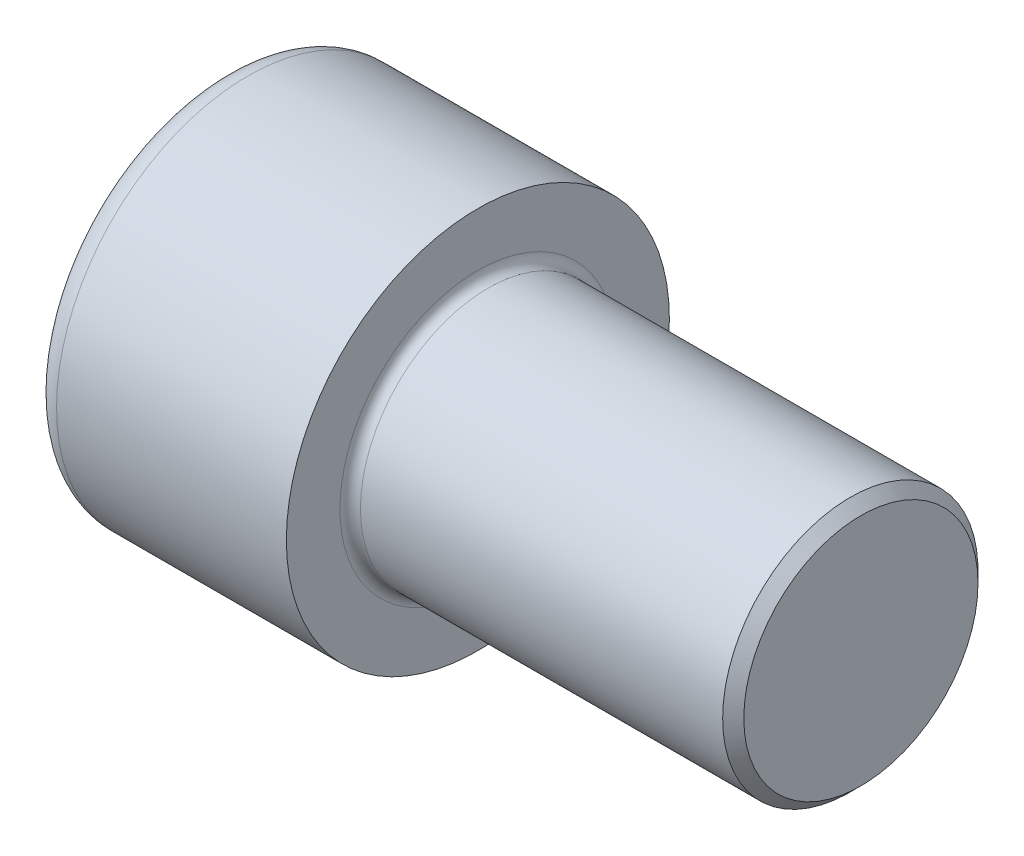
ISO-10303-21;
HEADER;
FILE_DESCRIPTION(('STEP AP214'),'2;1');
FILE_NAME('part.step','',(''),(''),'','','');
FILE_SCHEMA(('AUTOMOTIVE_DESIGN { 1 0 10303 214 1 1 1 1 }'));
ENDSEC;
DATA;
#1=APPLICATION_CONTEXT('core data for automotive mechanical design processes');
#2=APPLICATION_PROTOCOL_DEFINITION('international standard','automotive_design',2000,#1);
#3=PRODUCT_CONTEXT('',#1,'mechanical');
#4=PRODUCT('Part','Part','',(#3));
#5=PRODUCT_RELATED_PRODUCT_CATEGORY('part','',(#4));
#6=PRODUCT_DEFINITION_FORMATION('','',#4);
#7=PRODUCT_DEFINITION_CONTEXT('part definition',#1,'design');
#8=PRODUCT_DEFINITION('design','',#6,#7);
#9=PRODUCT_DEFINITION_SHAPE('','',#8);
#10=(LENGTH_UNIT() NAMED_UNIT(*) SI_UNIT(.MILLI.,.METRE.));
#11=(NAMED_UNIT(*) PLANE_ANGLE_UNIT() SI_UNIT($,.RADIAN.));
#12=(NAMED_UNIT(*) SI_UNIT($,.STERADIAN.) SOLID_ANGLE_UNIT());
#13=UNCERTAINTY_MEASURE_WITH_UNIT(LENGTH_MEASURE(1.E-05),#10,'distance_accuracy_value','');
#14=(GEOMETRIC_REPRESENTATION_CONTEXT(3) GLOBAL_UNCERTAINTY_ASSIGNED_CONTEXT((#13)) GLOBAL_UNIT_ASSIGNED_CONTEXT((#10,
#11,#12)) REPRESENTATION_CONTEXT('',''));
#15=CARTESIAN_POINT('',(0.,0.,0.));
#16=DIRECTION('',(0.,0.,1.));
#17=DIRECTION('',(1.,0.,0.));
#18=AXIS2_PLACEMENT_3D('',#15,#16,#17);
#19=CARTESIAN_POINT('',(0.,0.,0.));
#20=DIRECTION('',(-1.,0.,0.));
#21=DIRECTION('',(0.,0.,1.));
#22=AXIS2_PLACEMENT_3D('',#19,#20,#21);
#23=PLANE('',#22);
#24=DIRECTION('',(0.,-0.499999999999999,0.866025403784439));
#25=VECTOR('',#24,1.);
#26=CARTESIAN_POINT('',(0.,9.84382208968312,0.));
#27=LINE('',#26,#25);
#28=CARTESIAN_POINT('',(0.,9.84382208968312,0.));
#29=VERTEX_POINT('',#28);
#30=CARTESIAN_POINT('',(0.,4.92191104484157,8.52499999999999));
#31=VERTEX_POINT('',#30);
#32=EDGE_CURVE('E264',#29,#31,#27,.T.);
#33=ORIENTED_EDGE('',*,*,#32,.T.);
#34=DIRECTION('',(0.,1.,0.));
#35=VECTOR('',#34,1.);
#36=CARTESIAN_POINT('',(0.,-4.92191104484155,8.525));
#37=LINE('',#36,#35);
#38=CARTESIAN_POINT('',(0.,-4.92191104484155,8.525));
#39=VERTEX_POINT('',#38);
#40=EDGE_CURVE('E136',#39,#31,#37,.T.);
#41=ORIENTED_EDGE('',*,*,#40,.F.);
#42=DIRECTION('',(0.,-0.500000000000001,-0.866025403784438));
#43=VECTOR('',#42,1.);
#44=CARTESIAN_POINT('',(0.,-4.92191104484155,8.525));
#45=LINE('',#44,#43);
#46=CARTESIAN_POINT('',(0.,-9.84382208968312,0.));
#47=VERTEX_POINT('',#46);
#48=EDGE_CURVE('E267',#39,#47,#45,.T.);
#49=ORIENTED_EDGE('',*,*,#48,.T.);
#50=DIRECTION('',(0.,0.499999999999999,-0.866025403784439));
#51=VECTOR('',#50,1.);
#52=CARTESIAN_POINT('',(0.,-9.84382208968312,0.));
#53=LINE('',#52,#51);
#54=CARTESIAN_POINT('',(0.,-4.92191104484157,-8.525));
#55=VERTEX_POINT('',#54);
#56=EDGE_CURVE('E270',#47,#55,#53,.T.);
#57=ORIENTED_EDGE('',*,*,#56,.T.);
#58=DIRECTION('',(0.,-1.,0.));
#59=VECTOR('',#58,1.);
#60=CARTESIAN_POINT('',(0.,4.92191104484154,-8.52500000000001));
#61=LINE('',#60,#59);
#62=CARTESIAN_POINT('',(0.,4.92191104484154,-8.52500000000001));
#63=VERTEX_POINT('',#62);
#64=EDGE_CURVE('E273',#63,#55,#61,.T.);
#65=ORIENTED_EDGE('',*,*,#64,.F.);
#66=DIRECTION('',(0.,-0.500000000000001,-0.866025403784438));
#67=VECTOR('',#66,1.);
#68=CARTESIAN_POINT('',(0.,9.84382208968312,0.));
#69=LINE('',#68,#67);
#70=EDGE_CURVE('E131',#29,#63,#69,.T.);
#71=ORIENTED_EDGE('',*,*,#70,.F.);
#72=EDGE_LOOP('',(#33,#41,#49,#57,#65,#71));
#73=FACE_BOUND('',#72,.T.);
#74=CARTESIAN_POINT('',(0.,0.,0.));
#75=DIRECTION('',(-1.,0.,0.));
#76=DIRECTION('',(0.,0.,1.));
#77=AXIS2_PLACEMENT_3D('',#74,#75,#76);
#78=CIRCLE('',#77,13.);
#79=CARTESIAN_POINT('',(0.,0.,13.));
#80=VERTEX_POINT('',#79);
#81=EDGE_CURVE('E48',#80,#80,#78,.T.);
#82=ORIENTED_EDGE('',*,*,#81,.T.);
#83=EDGE_LOOP('',(#82));
#84=FACE_BOUND('',#83,.T.);
#85=ADVANCED_FACE('F40',(#73,#84),#23,.T.);
#86=CARTESIAN_POINT('',(-31.75,0.,0.));
#87=DIRECTION('',(-1.,0.,0.));
#88=DIRECTION('',(0.,0.,1.));
#89=AXIS2_PLACEMENT_3D('',#86,#87,#88);
#90=CYLINDRICAL_SURFACE('',#89,15.);
#91=CARTESIAN_POINT('',(2.,0.,0.));
#92=DIRECTION('',(-1.,0.,0.));
#93=DIRECTION('',(0.,0.,1.));
#94=AXIS2_PLACEMENT_3D('',#91,#92,#93);
#95=CIRCLE('',#94,15.);
#96=CARTESIAN_POINT('',(2.,0.,15.));
#97=VERTEX_POINT('',#96);
#98=EDGE_CURVE('E11',#97,#97,#95,.F.);
#99=ORIENTED_EDGE('',*,*,#98,.T.);
#100=EDGE_LOOP('',(#99));
#101=FACE_BOUND('',#100,.T.);
#102=CARTESIAN_POINT('',(20.,0.,0.));
#103=DIRECTION('',(-1.,0.,0.));
#104=DIRECTION('',(0.,0.,1.));
#105=AXIS2_PLACEMENT_3D('',#102,#103,#104);
#106=CIRCLE('',#105,15.);
#107=CARTESIAN_POINT('',(20.,0.,15.));
#108=VERTEX_POINT('',#107);
#109=EDGE_CURVE('E154',#108,#108,#106,.T.);
#110=ORIENTED_EDGE('',*,*,#109,.T.);
#111=EDGE_LOOP('',(#110));
#112=FACE_BOUND('',#111,.T.);
#113=ADVANCED_FACE('F179',(#101,#112),#90,.T.);
#114=CARTESIAN_POINT('',(20.,15.,0.));
#115=DIRECTION('',(1.,0.,0.));
#116=DIRECTION('',(0.,0.,-1.));
#117=AXIS2_PLACEMENT_3D('',#114,#115,#116);
#118=PLANE('',#117);
#119=CARTESIAN_POINT('',(20.,0.,0.));
#120=DIRECTION('',(1.,0.,0.));
#121=DIRECTION('',(0.,0.,-1.));
#122=AXIS2_PLACEMENT_3D('',#119,#120,#121);
#123=CIRCLE('',#122,10.8);
#124=CARTESIAN_POINT('',(20.,0.,-10.8));
#125=VERTEX_POINT('',#124);
#126=EDGE_CURVE('E157',#125,#125,#123,.F.);
#127=ORIENTED_EDGE('',*,*,#126,.T.);
#128=EDGE_LOOP('',(#127));
#129=FACE_BOUND('',#128,.T.);
#130=ORIENTED_EDGE('',*,*,#109,.F.);
#131=EDGE_LOOP('',(#130));
#132=FACE_BOUND('',#131,.T.);
#133=ADVANCED_FACE('F184',(#129,#132),#118,.T.);
#134=CARTESIAN_POINT('',(-31.75,0.,0.));
#135=DIRECTION('',(-1.,0.,0.));
#136=DIRECTION('',(0.,0.,1.));
#137=AXIS2_PLACEMENT_3D('',#134,#135,#136);
#138=CYLINDRICAL_SURFACE('',#137,10.);
#139=CARTESIAN_POINT('',(20.8,0.,0.));
#140=DIRECTION('',(1.,0.,0.));
#141=DIRECTION('',(0.,0.,-1.));
#142=AXIS2_PLACEMENT_3D('',#139,#140,#141);
#143=CIRCLE('',#142,10.);
#144=CARTESIAN_POINT('',(20.8,0.,-10.));
#145=VERTEX_POINT('',#144);
#146=EDGE_CURVE('E160',#145,#145,#143,.T.);
#147=ORIENTED_EDGE('',*,*,#146,.T.);
#148=EDGE_LOOP('',(#147));
#149=FACE_BOUND('',#148,.T.);
#150=CARTESIAN_POINT('',(49.172,0.,0.));
#151=DIRECTION('',(-1.,0.,0.));
#152=DIRECTION('',(0.,0.,1.));
#153=AXIS2_PLACEMENT_3D('',#150,#151,#152);
#154=CIRCLE('',#153,10.);
#155=CARTESIAN_POINT('',(49.172,0.,10.));
#156=VERTEX_POINT('',#155);
#157=EDGE_CURVE('E151',#156,#156,#154,.T.);
#158=ORIENTED_EDGE('',*,*,#157,.T.);
#159=EDGE_LOOP('',(#158));
#160=FACE_BOUND('',#159,.T.);
#161=ADVANCED_FACE('F190',(#149,#160),#138,.T.);
#162=CARTESIAN_POINT('',(50.,0.,0.));
#163=DIRECTION('',(-1.,0.,0.));
#164=DIRECTION('',(0.,0.,1.));
#165=AXIS2_PLACEMENT_3D('',#162,#163,#164);
#166=CONICAL_SURFACE('',#165,9.172,0.78539816339745);
#167=ORIENTED_EDGE('',*,*,#157,.F.);
#168=EDGE_LOOP('',(#167));
#169=FACE_BOUND('',#168,.T.);
#170=CARTESIAN_POINT('',(50.,0.,0.));
#171=DIRECTION('',(-1.,0.,0.));
#172=DIRECTION('',(0.,0.,1.));
#173=AXIS2_PLACEMENT_3D('',#170,#171,#172);
#174=CIRCLE('',#173,9.172);
#175=CARTESIAN_POINT('',(50.,0.,9.172));
#176=VERTEX_POINT('',#175);
#177=EDGE_CURVE('E147',#176,#176,#174,.T.);
#178=ORIENTED_EDGE('',*,*,#177,.T.);
#179=EDGE_LOOP('',(#178));
#180=FACE_BOUND('',#179,.T.);
#181=ADVANCED_FACE('F194',(#169,#180),#166,.T.);
#182=CARTESIAN_POINT('',(50.,9.172,0.));
#183=DIRECTION('',(1.,0.,0.));
#184=DIRECTION('',(0.,0.,-1.));
#185=AXIS2_PLACEMENT_3D('',#182,#183,#184);
#186=PLANE('',#185);
#187=ORIENTED_EDGE('',*,*,#177,.F.);
#188=EDGE_LOOP('',(#187));
#189=FACE_BOUND('',#188,.T.);
#190=ADVANCED_FACE('F176',(#189),#186,.T.);
#191=CARTESIAN_POINT('',(20.8,0.,0.));
#192=DIRECTION('',(1.,0.,0.));
#193=DIRECTION('',(0.,0.,-1.));
#194=AXIS2_PLACEMENT_3D('',#191,#192,#193);
#195=TOROIDAL_SURFACE('',#194,10.8,0.8);
#196=ORIENTED_EDGE('',*,*,#146,.F.);
#197=EDGE_LOOP('',(#196));
#198=FACE_BOUND('',#197,.T.);
#199=ORIENTED_EDGE('',*,*,#126,.F.);
#200=EDGE_LOOP('',(#199));
#201=FACE_BOUND('',#200,.T.);
#202=ADVANCED_FACE('F167',(#198,#201),#195,.F.);
#203=CARTESIAN_POINT('',(2.,0.,0.));
#204=DIRECTION('',(-1.,0.,0.));
#205=DIRECTION('',(0.,0.,1.));
#206=AXIS2_PLACEMENT_3D('',#203,#204,#205);
#207=TOROIDAL_SURFACE('',#206,13.,2.);
#208=ORIENTED_EDGE('',*,*,#98,.F.);
#209=EDGE_LOOP('',(#208));
#210=FACE_BOUND('',#209,.T.);
#211=ORIENTED_EDGE('',*,*,#81,.F.);
#212=EDGE_LOOP('',(#211));
#213=FACE_BOUND('',#212,.T.);
#214=ADVANCED_FACE('F42',(#210,#213),#207,.T.);
#215=CARTESIAN_POINT('',(10.,9.84382208968312,0.));
#216=DIRECTION('',(0.,-0.866025403784439,-0.499999999999999));
#217=DIRECTION('',(0.,0.499999999999999,-0.866025403784439));
#218=AXIS2_PLACEMENT_3D('',#215,#216,#217);
#219=PLANE('',#218);
#220=ORIENTED_EDGE('',*,*,#32,.F.);
#221=DIRECTION('',(-1.,0.,0.));
#222=VECTOR('',#221,1.);
#223=CARTESIAN_POINT('',(10.,9.84382208968312,0.));
#224=LINE('',#223,#222);
#225=CARTESIAN_POINT('',(10.,9.84382208968312,0.));
#226=VERTEX_POINT('',#225);
#227=EDGE_CURVE('E254',#226,#29,#224,.T.);
#228=ORIENTED_EDGE('',*,*,#227,.F.);
#229=DIRECTION('',(0.,-0.499999999999999,0.866025403784439));
#230=VECTOR('',#229,1.);
#231=CARTESIAN_POINT('',(10.,9.84382208968312,0.));
#232=LINE('',#231,#230);
#233=CARTESIAN_POINT('',(10.,7.38286656726234,4.26249999999999));
#234=VERTEX_POINT('',#233);
#235=EDGE_CURVE('E123',#226,#234,#232,.T.);
#236=ORIENTED_EDGE('',*,*,#235,.T.);
#237=CARTESIAN_POINT('',(10.,4.92191104484157,8.52499999999999));
#238=VERTEX_POINT('',#237);
#239=EDGE_CURVE('E114',#234,#238,#232,.T.);
#240=ORIENTED_EDGE('',*,*,#239,.T.);
#241=DIRECTION('',(-1.,0.,0.));
#242=VECTOR('',#241,1.);
#243=CARTESIAN_POINT('',(10.,4.92191104484157,8.52499999999999));
#244=LINE('',#243,#242);
#245=EDGE_CURVE('E128',#238,#31,#244,.T.);
#246=ORIENTED_EDGE('',*,*,#245,.T.);
#247=EDGE_LOOP('',(#220,#228,#236,#240,#246));
#248=FACE_BOUND('',#247,.T.);
#249=ADVANCED_FACE('F127',(#248),#219,.T.);
#250=CARTESIAN_POINT('',(10.,-4.92191104484155,8.525));
#251=DIRECTION('',(0.,0.,1.));
#252=DIRECTION('',(0.,-1.,0.));
#253=AXIS2_PLACEMENT_3D('',#250,#251,#252);
#254=PLANE('',#253);
#255=ORIENTED_EDGE('',*,*,#40,.T.);
#256=ORIENTED_EDGE('',*,*,#245,.F.);
#257=DIRECTION('',(0.,1.,0.));
#258=VECTOR('',#257,1.);
#259=CARTESIAN_POINT('',(10.,-4.92191104484155,8.525));
#260=LINE('',#259,#258);
#261=CARTESIAN_POINT('',(10.,0.,8.525));
#262=VERTEX_POINT('',#261);
#263=EDGE_CURVE('E111',#262,#238,#260,.T.);
#264=ORIENTED_EDGE('',*,*,#263,.F.);
#265=CARTESIAN_POINT('',(10.,-4.92191104484155,8.525));
#266=VERTEX_POINT('',#265);
#267=EDGE_CURVE('E122',#266,#262,#260,.T.);
#268=ORIENTED_EDGE('',*,*,#267,.F.);
#269=DIRECTION('',(-1.,0.,0.));
#270=VECTOR('',#269,1.);
#271=CARTESIAN_POINT('',(10.,-4.92191104484155,8.525));
#272=LINE('',#271,#270);
#273=EDGE_CURVE('E138',#266,#39,#272,.T.);
#274=ORIENTED_EDGE('',*,*,#273,.T.);
#275=EDGE_LOOP('',(#255,#256,#264,#268,#274));
#276=FACE_BOUND('',#275,.T.);
#277=ADVANCED_FACE('F133',(#276),#254,.F.);
#278=CARTESIAN_POINT('',(10.,-4.92191104484155,8.525));
#279=DIRECTION('',(0.,0.866025403784438,-0.500000000000001));
#280=DIRECTION('',(0.,0.500000000000001,0.866025403784438));
#281=AXIS2_PLACEMENT_3D('',#278,#279,#280);
#282=PLANE('',#281);
#283=ORIENTED_EDGE('',*,*,#48,.F.);
#284=ORIENTED_EDGE('',*,*,#273,.F.);
#285=DIRECTION('',(0.,-0.500000000000001,-0.866025403784438));
#286=VECTOR('',#285,1.);
#287=CARTESIAN_POINT('',(10.,-4.92191104484155,8.525));
#288=LINE('',#287,#286);
#289=CARTESIAN_POINT('',(10.,-7.38286656726234,4.26250000000001));
#290=VERTEX_POINT('',#289);
#291=EDGE_CURVE('E293',#266,#290,#288,.T.);
#292=ORIENTED_EDGE('',*,*,#291,.T.);
#293=CARTESIAN_POINT('',(10.,-9.84382208968312,0.));
#294=VERTEX_POINT('',#293);
#295=EDGE_CURVE('E282',#290,#294,#288,.T.);
#296=ORIENTED_EDGE('',*,*,#295,.T.);
#297=DIRECTION('',(-1.,0.,0.));
#298=VECTOR('',#297,1.);
#299=CARTESIAN_POINT('',(10.,-9.84382208968312,0.));
#300=LINE('',#299,#298);
#301=EDGE_CURVE('E143',#294,#47,#300,.T.);
#302=ORIENTED_EDGE('',*,*,#301,.T.);
#303=EDGE_LOOP('',(#283,#284,#292,#296,#302));
#304=FACE_BOUND('',#303,.T.);
#305=ADVANCED_FACE('F208',(#304),#282,.T.);
#306=CARTESIAN_POINT('',(10.,-9.84382208968312,0.));
#307=DIRECTION('',(0.,0.866025403784439,0.499999999999999));
#308=DIRECTION('',(0.,-0.499999999999999,0.866025403784439));
#309=AXIS2_PLACEMENT_3D('',#306,#307,#308);
#310=PLANE('',#309);
#311=ORIENTED_EDGE('',*,*,#56,.F.);
#312=ORIENTED_EDGE('',*,*,#301,.F.);
#313=DIRECTION('',(0.,0.499999999999999,-0.866025403784439));
#314=VECTOR('',#313,1.);
#315=CARTESIAN_POINT('',(10.,-9.84382208968312,0.));
#316=LINE('',#315,#314);
#317=CARTESIAN_POINT('',(10.,-7.38286656726235,-4.26249999999999));
#318=VERTEX_POINT('',#317);
#319=EDGE_CURVE('E260',#294,#318,#316,.T.);
#320=ORIENTED_EDGE('',*,*,#319,.T.);
#321=CARTESIAN_POINT('',(10.,-4.92191104484157,-8.525));
#322=VERTEX_POINT('',#321);
#323=EDGE_CURVE('E292',#318,#322,#316,.T.);
#324=ORIENTED_EDGE('',*,*,#323,.T.);
#325=DIRECTION('',(-1.,0.,0.));
#326=VECTOR('',#325,1.);
#327=CARTESIAN_POINT('',(10.,-4.92191104484157,-8.525));
#328=LINE('',#327,#326);
#329=EDGE_CURVE('E253',#322,#55,#328,.T.);
#330=ORIENTED_EDGE('',*,*,#329,.T.);
#331=EDGE_LOOP('',(#311,#312,#320,#324,#330));
#332=FACE_BOUND('',#331,.T.);
#333=ADVANCED_FACE('F211',(#332),#310,.T.);
#334=CARTESIAN_POINT('',(10.,4.92191104484154,-8.52500000000001));
#335=DIRECTION('',(0.,0.,-1.));
#336=DIRECTION('',(0.,1.,0.));
#337=AXIS2_PLACEMENT_3D('',#334,#335,#336);
#338=PLANE('',#337);
#339=ORIENTED_EDGE('',*,*,#64,.T.);
#340=ORIENTED_EDGE('',*,*,#329,.F.);
#341=DIRECTION('',(0.,-1.,0.));
#342=VECTOR('',#341,1.);
#343=CARTESIAN_POINT('',(10.,4.92191104484154,-8.52500000000001));
#344=LINE('',#343,#342);
#345=CARTESIAN_POINT('',(10.,0.,-8.525));
#346=VERTEX_POINT('',#345);
#347=EDGE_CURVE('E257',#346,#322,#344,.T.);
#348=ORIENTED_EDGE('',*,*,#347,.F.);
#349=CARTESIAN_POINT('',(10.,4.92191104484154,-8.52500000000001));
#350=VERTEX_POINT('',#349);
#351=EDGE_CURVE('E55',#350,#346,#344,.T.);
#352=ORIENTED_EDGE('',*,*,#351,.F.);
#353=DIRECTION('',(-1.,0.,0.));
#354=VECTOR('',#353,1.);
#355=CARTESIAN_POINT('',(10.,4.92191104484154,-8.52500000000001));
#356=LINE('',#355,#354);
#357=EDGE_CURVE('E250',#350,#63,#356,.T.);
#358=ORIENTED_EDGE('',*,*,#357,.T.);
#359=EDGE_LOOP('',(#339,#340,#348,#352,#358));
#360=FACE_BOUND('',#359,.T.);
#361=ADVANCED_FACE('F215',(#360),#338,.F.);
#362=CARTESIAN_POINT('',(10.,9.84382208968312,0.));
#363=DIRECTION('',(0.,0.866025403784438,-0.500000000000001));
#364=DIRECTION('',(0.,0.500000000000001,0.866025403784438));
#365=AXIS2_PLACEMENT_3D('',#362,#363,#364);
#366=PLANE('',#365);
#367=ORIENTED_EDGE('',*,*,#70,.T.);
#368=ORIENTED_EDGE('',*,*,#357,.F.);
#369=DIRECTION('',(0.,-0.500000000000001,-0.866025403784438));
#370=VECTOR('',#369,1.);
#371=CARTESIAN_POINT('',(10.,9.84382208968312,0.));
#372=LINE('',#371,#370);
#373=CARTESIAN_POINT('',(10.,7.38286656726233,-4.26250000000001));
#374=VERTEX_POINT('',#373);
#375=EDGE_CURVE('E240',#374,#350,#372,.T.);
#376=ORIENTED_EDGE('',*,*,#375,.F.);
#377=EDGE_CURVE('E246',#226,#374,#372,.T.);
#378=ORIENTED_EDGE('',*,*,#377,.F.);
#379=ORIENTED_EDGE('',*,*,#227,.T.);
#380=EDGE_LOOP('',(#367,#368,#376,#378,#379));
#381=FACE_BOUND('',#380,.T.);
#382=ADVANCED_FACE('F219',(#381),#366,.F.);
#383=CARTESIAN_POINT('',(10.,9.84382208968312,0.));
#384=DIRECTION('',(1.,0.,0.));
#385=DIRECTION('',(0.,0.,-1.));
#386=AXIS2_PLACEMENT_3D('',#383,#384,#385);
#387=PLANE('',#386);
#388=ORIENTED_EDGE('',*,*,#347,.T.);
#389=ORIENTED_EDGE('',*,*,#323,.F.);
#390=CARTESIAN_POINT('',(10.,0.,0.));
#391=DIRECTION('',(-1.,0.,0.));
#392=DIRECTION('',(0.,0.,1.));
#393=AXIS2_PLACEMENT_3D('',#390,#391,#392);
#394=CIRCLE('',#393,8.525);
#395=EDGE_CURVE('E288',#346,#318,#394,.T.);
#396=ORIENTED_EDGE('',*,*,#395,.F.);
#397=EDGE_LOOP('',(#388,#389,#396));
#398=FACE_BOUND('',#397,.T.);
#399=ADVANCED_FACE('F223',(#398),#387,.F.);
#400=ORIENTED_EDGE('',*,*,#319,.F.);
#401=ORIENTED_EDGE('',*,*,#295,.F.);
#402=EDGE_CURVE('E141',#318,#290,#394,.T.);
#403=ORIENTED_EDGE('',*,*,#402,.F.);
#404=EDGE_LOOP('',(#400,#401,#403));
#405=FACE_BOUND('',#404,.T.);
#406=ADVANCED_FACE('F226',(#405),#387,.F.);
#407=ORIENTED_EDGE('',*,*,#291,.F.);
#408=ORIENTED_EDGE('',*,*,#267,.T.);
#409=EDGE_CURVE('E137',#290,#262,#394,.T.);
#410=ORIENTED_EDGE('',*,*,#409,.F.);
#411=EDGE_LOOP('',(#407,#408,#410));
#412=FACE_BOUND('',#411,.T.);
#413=ADVANCED_FACE('F231',(#412),#387,.F.);
#414=ORIENTED_EDGE('',*,*,#263,.T.);
#415=ORIENTED_EDGE('',*,*,#239,.F.);
#416=EDGE_CURVE('E117',#262,#234,#394,.T.);
#417=ORIENTED_EDGE('',*,*,#416,.F.);
#418=EDGE_LOOP('',(#414,#415,#417));
#419=FACE_BOUND('',#418,.T.);
#420=ADVANCED_FACE('F113',(#419),#387,.F.);
#421=ORIENTED_EDGE('',*,*,#235,.F.);
#422=ORIENTED_EDGE('',*,*,#377,.T.);
#423=EDGE_CURVE('E148',#234,#374,#394,.T.);
#424=ORIENTED_EDGE('',*,*,#423,.F.);
#425=EDGE_LOOP('',(#421,#422,#424));
#426=FACE_BOUND('',#425,.T.);
#427=ADVANCED_FACE('F234',(#426),#387,.F.);
#428=ORIENTED_EDGE('',*,*,#375,.T.);
#429=ORIENTED_EDGE('',*,*,#351,.T.);
#430=EDGE_CURVE('E243',#374,#346,#394,.T.);
#431=ORIENTED_EDGE('',*,*,#430,.F.);
#432=EDGE_LOOP('',(#428,#429,#431));
#433=FACE_BOUND('',#432,.T.);
#434=ADVANCED_FACE('F204',(#433),#387,.F.);
#435=CARTESIAN_POINT('',(10.,0.,0.));
#436=DIRECTION('',(-1.,0.,0.));
#437=DIRECTION('',(0.,0.,1.));
#438=AXIS2_PLACEMENT_3D('',#435,#436,#437);
#439=CONICAL_SURFACE('',#438,8.525,1.04719755119659);
#440=CARTESIAN_POINT('',(14.9219110448416,0.,0.));
#441=VERTEX_POINT('',#440);
#442=VERTEX_LOOP('',#441);
#443=FACE_BOUND('',#442,.T.);
#444=ORIENTED_EDGE('',*,*,#416,.T.);
#445=ORIENTED_EDGE('',*,*,#423,.T.);
#446=ORIENTED_EDGE('',*,*,#430,.T.);
#447=ORIENTED_EDGE('',*,*,#395,.T.);
#448=ORIENTED_EDGE('',*,*,#402,.T.);
#449=ORIENTED_EDGE('',*,*,#409,.T.);
#450=EDGE_LOOP('',(#444,#445,#446,#447,#448,#449));
#451=FACE_BOUND('',#450,.T.);
#452=ADVANCED_FACE('F202',(#443,#451),#439,.F.);
#453=CLOSED_SHELL('',(#85,#113,#133,#161,#181,#190,#202,#214,#249,#277,#305,#333,#361,#382,#399,
#406,#413,#420,#427,#434,#452));
#454=MANIFOLD_SOLID_BREP('B2',#453);
#455=ADVANCED_BREP_SHAPE_REPRESENTATION('',(#18,#454),#14);
#456=SHAPE_DEFINITION_REPRESENTATION(#9,#455);
ENDSEC;
END-ISO-10303-21;
